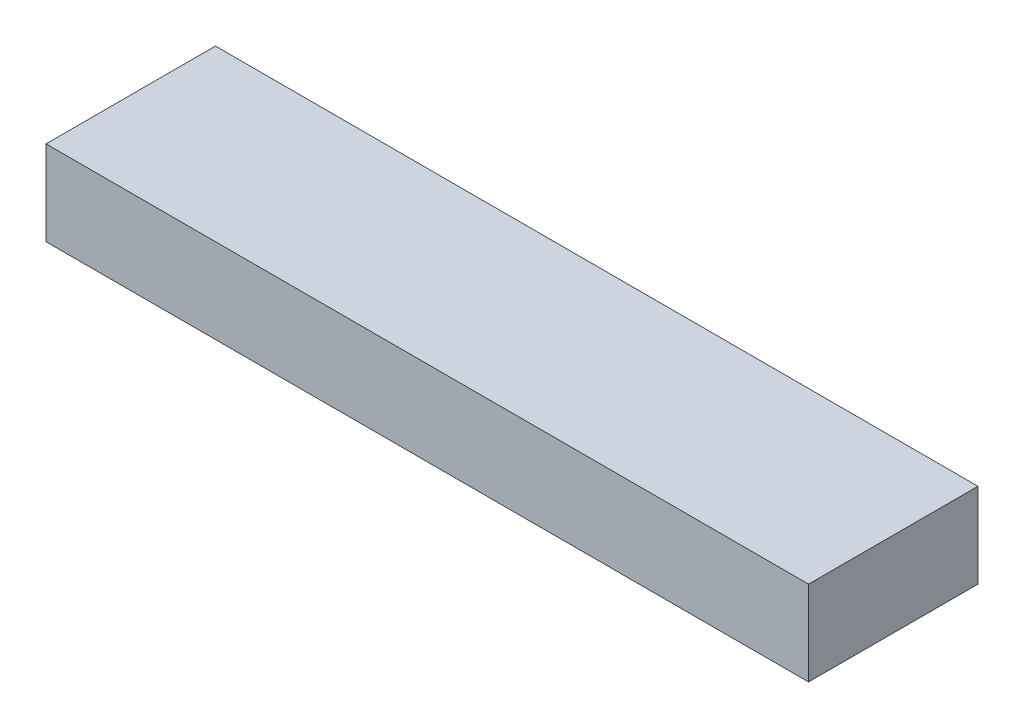
ISO-10303-21;
HEADER;
FILE_DESCRIPTION(('STEP AP214'),'2;1');
FILE_NAME('part.step','',(''),(''),'','','');
FILE_SCHEMA(('AUTOMOTIVE_DESIGN { 1 0 10303 214 1 1 1 1 }'));
ENDSEC;
DATA;
#1=APPLICATION_CONTEXT('core data for automotive mechanical design processes');
#2=APPLICATION_PROTOCOL_DEFINITION('international standard','automotive_design',2000,#1);
#3=PRODUCT_CONTEXT('',#1,'mechanical');
#4=PRODUCT('Part','Part','',(#3));
#5=PRODUCT_RELATED_PRODUCT_CATEGORY('part','',(#4));
#6=PRODUCT_DEFINITION_FORMATION('','',#4);
#7=PRODUCT_DEFINITION_CONTEXT('part definition',#1,'design');
#8=PRODUCT_DEFINITION('design','',#6,#7);
#9=PRODUCT_DEFINITION_SHAPE('','',#8);
#10=(LENGTH_UNIT() NAMED_UNIT(*) SI_UNIT(.MILLI.,.METRE.));
#11=(NAMED_UNIT(*) PLANE_ANGLE_UNIT() SI_UNIT($,.RADIAN.));
#12=(NAMED_UNIT(*) SI_UNIT($,.STERADIAN.) SOLID_ANGLE_UNIT());
#13=UNCERTAINTY_MEASURE_WITH_UNIT(LENGTH_MEASURE(1.E-05),#10,'distance_accuracy_value','');
#14=(GEOMETRIC_REPRESENTATION_CONTEXT(3) GLOBAL_UNCERTAINTY_ASSIGNED_CONTEXT((#13)) GLOBAL_UNIT_ASSIGNED_CONTEXT((#10,
#11,#12)) REPRESENTATION_CONTEXT('',''));
#15=CARTESIAN_POINT('',(0.,0.,0.));
#16=DIRECTION('',(0.,0.,1.));
#17=DIRECTION('',(1.,0.,0.));
#18=AXIS2_PLACEMENT_3D('',#15,#16,#17);
#19=CARTESIAN_POINT('',(-9.,2.,-16.));
#20=DIRECTION('',(1.,0.,0.));
#21=DIRECTION('',(0.,0.,-1.));
#22=AXIS2_PLACEMENT_3D('',#19,#20,#21);
#23=PLANE('',#22);
#24=DIRECTION('',(0.,0.,1.));
#25=VECTOR('',#24,1.);
#26=CARTESIAN_POINT('',(-9.,0.,-16.));
#27=LINE('',#26,#25);
#28=CARTESIAN_POINT('',(-9.,0.,-16.));
#29=VERTEX_POINT('',#28);
#30=CARTESIAN_POINT('',(-9.,0.,-12.));
#31=VERTEX_POINT('',#30);
#32=EDGE_CURVE('E96',#29,#31,#27,.T.);
#33=ORIENTED_EDGE('',*,*,#32,.T.);
#34=DIRECTION('',(0.,-1.,0.));
#35=VECTOR('',#34,1.);
#36=CARTESIAN_POINT('',(-9.,2.,-12.));
#37=LINE('',#36,#35);
#38=CARTESIAN_POINT('',(-9.,2.,-12.));
#39=VERTEX_POINT('',#38);
#40=EDGE_CURVE('E11',#39,#31,#37,.T.);
#41=ORIENTED_EDGE('',*,*,#40,.F.);
#42=DIRECTION('',(0.,0.,1.));
#43=VECTOR('',#42,1.);
#44=CARTESIAN_POINT('',(-9.,2.,-16.));
#45=LINE('',#44,#43);
#46=CARTESIAN_POINT('',(-9.,2.,-16.));
#47=VERTEX_POINT('',#46);
#48=EDGE_CURVE('E82',#47,#39,#45,.T.);
#49=ORIENTED_EDGE('',*,*,#48,.F.);
#50=DIRECTION('',(0.,-1.,0.));
#51=VECTOR('',#50,1.);
#52=CARTESIAN_POINT('',(-9.,2.,-16.));
#53=LINE('',#52,#51);
#54=EDGE_CURVE('E49',#47,#29,#53,.T.);
#55=ORIENTED_EDGE('',*,*,#54,.T.);
#56=EDGE_LOOP('',(#33,#41,#49,#55));
#57=FACE_BOUND('',#56,.T.);
#58=ADVANCED_FACE('F33',(#57),#23,.F.);
#59=CARTESIAN_POINT('',(-9.,2.,-12.));
#60=DIRECTION('',(0.,0.,-1.));
#61=DIRECTION('',(-1.,0.,0.));
#62=AXIS2_PLACEMENT_3D('',#59,#60,#61);
#63=PLANE('',#62);
#64=DIRECTION('',(1.,0.,0.));
#65=VECTOR('',#64,1.);
#66=CARTESIAN_POINT('',(-9.,0.,-12.));
#67=LINE('',#66,#65);
#68=CARTESIAN_POINT('',(9.,0.,-12.));
#69=VERTEX_POINT('',#68);
#70=EDGE_CURVE('E87',#31,#69,#67,.T.);
#71=ORIENTED_EDGE('',*,*,#70,.T.);
#72=DIRECTION('',(0.,-1.,0.));
#73=VECTOR('',#72,1.);
#74=CARTESIAN_POINT('',(9.,2.,-12.));
#75=LINE('',#74,#73);
#76=CARTESIAN_POINT('',(9.,2.,-12.));
#77=VERTEX_POINT('',#76);
#78=EDGE_CURVE('E41',#77,#69,#75,.T.);
#79=ORIENTED_EDGE('',*,*,#78,.F.);
#80=DIRECTION('',(1.,0.,0.));
#81=VECTOR('',#80,1.);
#82=CARTESIAN_POINT('',(-9.,2.,-12.));
#83=LINE('',#82,#81);
#84=EDGE_CURVE('E74',#39,#77,#83,.T.);
#85=ORIENTED_EDGE('',*,*,#84,.F.);
#86=ORIENTED_EDGE('',*,*,#40,.T.);
#87=EDGE_LOOP('',(#71,#79,#85,#86));
#88=FACE_BOUND('',#87,.T.);
#89=ADVANCED_FACE('F86',(#88),#63,.F.);
#90=CARTESIAN_POINT('',(9.,2.,-16.));
#91=DIRECTION('',(1.,0.,0.));
#92=DIRECTION('',(0.,0.,-1.));
#93=AXIS2_PLACEMENT_3D('',#90,#91,#92);
#94=PLANE('',#93);
#95=DIRECTION('',(0.,0.,1.));
#96=VECTOR('',#95,1.);
#97=CARTESIAN_POINT('',(9.,0.,-16.));
#98=LINE('',#97,#96);
#99=CARTESIAN_POINT('',(9.,0.,-16.));
#100=VERTEX_POINT('',#99);
#101=EDGE_CURVE('E99',#100,#69,#98,.T.);
#102=ORIENTED_EDGE('',*,*,#101,.F.);
#103=DIRECTION('',(0.,-1.,0.));
#104=VECTOR('',#103,1.);
#105=CARTESIAN_POINT('',(9.,2.,-16.));
#106=LINE('',#105,#104);
#107=CARTESIAN_POINT('',(9.,2.,-16.));
#108=VERTEX_POINT('',#107);
#109=EDGE_CURVE('E63',#108,#100,#106,.T.);
#110=ORIENTED_EDGE('',*,*,#109,.F.);
#111=DIRECTION('',(0.,0.,1.));
#112=VECTOR('',#111,1.);
#113=CARTESIAN_POINT('',(9.,2.,-16.));
#114=LINE('',#113,#112);
#115=EDGE_CURVE('E81',#108,#77,#114,.T.);
#116=ORIENTED_EDGE('',*,*,#115,.T.);
#117=ORIENTED_EDGE('',*,*,#78,.T.);
#118=EDGE_LOOP('',(#102,#110,#116,#117));
#119=FACE_BOUND('',#118,.T.);
#120=ADVANCED_FACE('F90',(#119),#94,.T.);
#121=CARTESIAN_POINT('',(-9.,2.,-16.));
#122=DIRECTION('',(0.,0.,-1.));
#123=DIRECTION('',(-1.,0.,0.));
#124=AXIS2_PLACEMENT_3D('',#121,#122,#123);
#125=PLANE('',#124);
#126=DIRECTION('',(1.,0.,0.));
#127=VECTOR('',#126,1.);
#128=CARTESIAN_POINT('',(-9.,0.,-16.));
#129=LINE('',#128,#127);
#130=EDGE_CURVE('E101',#29,#100,#129,.T.);
#131=ORIENTED_EDGE('',*,*,#130,.F.);
#132=ORIENTED_EDGE('',*,*,#54,.F.);
#133=DIRECTION('',(1.,0.,0.));
#134=VECTOR('',#133,1.);
#135=CARTESIAN_POINT('',(-9.,2.,-16.));
#136=LINE('',#135,#134);
#137=EDGE_CURVE('E91',#47,#108,#136,.T.);
#138=ORIENTED_EDGE('',*,*,#137,.T.);
#139=ORIENTED_EDGE('',*,*,#109,.T.);
#140=EDGE_LOOP('',(#131,#132,#138,#139));
#141=FACE_BOUND('',#140,.T.);
#142=ADVANCED_FACE('F107',(#141),#125,.T.);
#143=CARTESIAN_POINT('',(0.,2.,0.));
#144=DIRECTION('',(0.,1.,0.));
#145=DIRECTION('',(0.,0.,1.));
#146=AXIS2_PLACEMENT_3D('',#143,#144,#145);
#147=PLANE('',#146);
#148=ORIENTED_EDGE('',*,*,#48,.T.);
#149=ORIENTED_EDGE('',*,*,#84,.T.);
#150=ORIENTED_EDGE('',*,*,#115,.F.);
#151=ORIENTED_EDGE('',*,*,#137,.F.);
#152=EDGE_LOOP('',(#148,#149,#150,#151));
#153=FACE_BOUND('',#152,.T.);
#154=ADVANCED_FACE('F78',(#153),#147,.T.);
#155=CARTESIAN_POINT('',(0.,0.,0.));
#156=DIRECTION('',(0.,1.,0.));
#157=DIRECTION('',(0.,0.,1.));
#158=AXIS2_PLACEMENT_3D('',#155,#156,#157);
#159=PLANE('',#158);
#160=ORIENTED_EDGE('',*,*,#32,.F.);
#161=ORIENTED_EDGE('',*,*,#130,.T.);
#162=ORIENTED_EDGE('',*,*,#101,.T.);
#163=ORIENTED_EDGE('',*,*,#70,.F.);
#164=EDGE_LOOP('',(#160,#161,#162,#163));
#165=FACE_BOUND('',#164,.T.);
#166=ADVANCED_FACE('F106',(#165),#159,.F.);
#167=CLOSED_SHELL('',(#58,#89,#120,#142,#154,#166));
#168=MANIFOLD_SOLID_BREP('B2',#167);
#169=ADVANCED_BREP_SHAPE_REPRESENTATION('',(#18,#168),#14);
#170=SHAPE_DEFINITION_REPRESENTATION(#9,#169);
ENDSEC;
END-ISO-10303-21;
